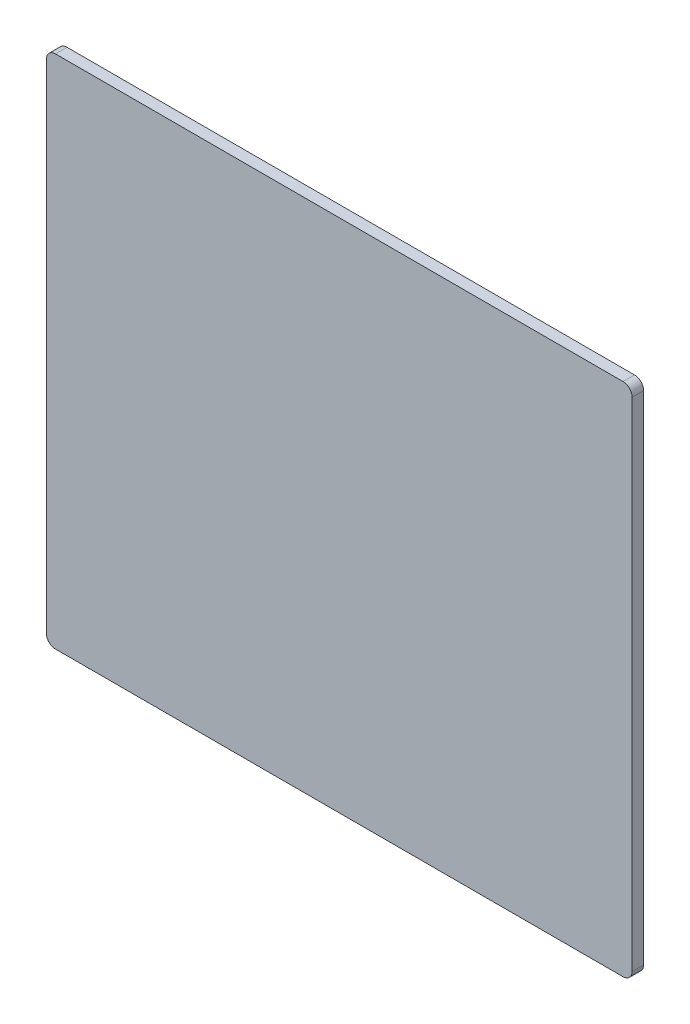
ISO-10303-21;
HEADER;
FILE_DESCRIPTION(('STEP AP214'),'2;1');
FILE_NAME('part.step','',(''),(''),'','','');
FILE_SCHEMA(('AUTOMOTIVE_DESIGN { 1 0 10303 214 1 1 1 1 }'));
ENDSEC;
DATA;
#1=APPLICATION_CONTEXT('core data for automotive mechanical design processes');
#2=APPLICATION_PROTOCOL_DEFINITION('international standard','automotive_design',2000,#1);
#3=PRODUCT_CONTEXT('',#1,'mechanical');
#4=PRODUCT('Part','Part','',(#3));
#5=PRODUCT_RELATED_PRODUCT_CATEGORY('part','',(#4));
#6=PRODUCT_DEFINITION_FORMATION('','',#4);
#7=PRODUCT_DEFINITION_CONTEXT('part definition',#1,'design');
#8=PRODUCT_DEFINITION('design','',#6,#7);
#9=PRODUCT_DEFINITION_SHAPE('','',#8);
#10=(LENGTH_UNIT() NAMED_UNIT(*) SI_UNIT(.MILLI.,.METRE.));
#11=(NAMED_UNIT(*) PLANE_ANGLE_UNIT() SI_UNIT($,.RADIAN.));
#12=(NAMED_UNIT(*) SI_UNIT($,.STERADIAN.) SOLID_ANGLE_UNIT());
#13=UNCERTAINTY_MEASURE_WITH_UNIT(LENGTH_MEASURE(1.E-05),#10,'distance_accuracy_value','');
#14=(GEOMETRIC_REPRESENTATION_CONTEXT(3) GLOBAL_UNCERTAINTY_ASSIGNED_CONTEXT((#13)) GLOBAL_UNIT_ASSIGNED_CONTEXT((#10,
#11,#12)) REPRESENTATION_CONTEXT('',''));
#15=CARTESIAN_POINT('',(0.,0.,0.));
#16=DIRECTION('',(0.,0.,1.));
#17=DIRECTION('',(1.,0.,0.));
#18=AXIS2_PLACEMENT_3D('',#15,#16,#17);
#19=CARTESIAN_POINT('',(-476.498046875,137.467578125,12.7));
#20=DIRECTION('',(1.,0.,0.));
#21=DIRECTION('',(0.,1.,0.));
#22=AXIS2_PLACEMENT_3D('',#19,#20,#21);
#23=PLANE('',#22);
#24=DIRECTION('',(0.,-1.,0.));
#25=VECTOR('',#24,1.);
#26=CARTESIAN_POINT('',(-476.498046875,137.467578125,0.));
#27=LINE('',#26,#25);
#28=CARTESIAN_POINT('',(-476.498046875,127.467578125,0.));
#29=VERTEX_POINT('',#28);
#30=CARTESIAN_POINT('',(-476.498046875,-422.508421875,0.));
#31=VERTEX_POINT('',#30);
#32=EDGE_CURVE('E188',#29,#31,#27,.T.);
#33=ORIENTED_EDGE('',*,*,#32,.T.);
#34=DIRECTION('',(0.,0.,-1.));
#35=VECTOR('',#34,1.);
#36=CARTESIAN_POINT('',(-476.498046875,-422.508421875,12.7));
#37=LINE('',#36,#35);
#38=CARTESIAN_POINT('',(-476.498046875,-422.508421875,12.7));
#39=VERTEX_POINT('',#38);
#40=EDGE_CURVE('E173',#31,#39,#37,.F.);
#41=ORIENTED_EDGE('',*,*,#40,.T.);
#42=DIRECTION('',(0.,-1.,0.));
#43=VECTOR('',#42,1.);
#44=CARTESIAN_POINT('',(-476.498046875,137.467578125,12.7));
#45=LINE('',#44,#43);
#46=CARTESIAN_POINT('',(-476.498046875,127.467578125,12.7));
#47=VERTEX_POINT('',#46);
#48=EDGE_CURVE('E190',#47,#39,#45,.T.);
#49=ORIENTED_EDGE('',*,*,#48,.F.);
#50=DIRECTION('',(0.,0.,-1.));
#51=VECTOR('',#50,1.);
#52=CARTESIAN_POINT('',(-476.498046875,127.467578125,0.));
#53=LINE('',#52,#51);
#54=EDGE_CURVE('E169',#47,#29,#53,.T.);
#55=ORIENTED_EDGE('',*,*,#54,.T.);
#56=EDGE_LOOP('',(#33,#41,#49,#55));
#57=FACE_BOUND('',#56,.T.);
#58=ADVANCED_FACE('F45',(#57),#23,.F.);
#59=CARTESIAN_POINT('',(-476.498046875,-432.508421875,12.7));
#60=DIRECTION('',(0.,1.,0.));
#61=DIRECTION('',(0.,0.,1.));
#62=AXIS2_PLACEMENT_3D('',#59,#60,#61);
#63=PLANE('',#62);
#64=DIRECTION('',(1.,0.,0.));
#65=VECTOR('',#64,1.);
#66=CARTESIAN_POINT('',(-476.498046875,-432.508421875,0.));
#67=LINE('',#66,#65);
#68=CARTESIAN_POINT('',(-466.498046875,-432.508421875,0.));
#69=VERTEX_POINT('',#68);
#70=CARTESIAN_POINT('',(161.201953125,-432.508421875,0.));
#71=VERTEX_POINT('',#70);
#72=EDGE_CURVE('E131',#69,#71,#67,.T.);
#73=ORIENTED_EDGE('',*,*,#72,.T.);
#74=DIRECTION('',(0.,0.,-1.));
#75=VECTOR('',#74,1.);
#76=CARTESIAN_POINT('',(161.201953125,-432.508421875,12.7));
#77=LINE('',#76,#75);
#78=CARTESIAN_POINT('',(161.201953125,-432.508421875,12.7));
#79=VERTEX_POINT('',#78);
#80=EDGE_CURVE('E155',#71,#79,#77,.F.);
#81=ORIENTED_EDGE('',*,*,#80,.T.);
#82=DIRECTION('',(1.,0.,0.));
#83=VECTOR('',#82,1.);
#84=CARTESIAN_POINT('',(-476.498046875,-432.508421875,12.7));
#85=LINE('',#84,#83);
#86=CARTESIAN_POINT('',(-466.498046875,-432.508421875,12.7));
#87=VERTEX_POINT('',#86);
#88=EDGE_CURVE('E200',#87,#79,#85,.T.);
#89=ORIENTED_EDGE('',*,*,#88,.F.);
#90=DIRECTION('',(0.,0.,-1.));
#91=VECTOR('',#90,1.);
#92=CARTESIAN_POINT('',(-466.498046875,-432.508421875,12.7));
#93=LINE('',#92,#91);
#94=EDGE_CURVE('E151',#87,#69,#93,.T.);
#95=ORIENTED_EDGE('',*,*,#94,.T.);
#96=EDGE_LOOP('',(#73,#81,#89,#95));
#97=FACE_BOUND('',#96,.T.);
#98=ADVANCED_FACE('F211',(#97),#63,.F.);
#99=CARTESIAN_POINT('',(171.201953125,137.467578125,12.7));
#100=DIRECTION('',(1.,0.,0.));
#101=DIRECTION('',(0.,1.,0.));
#102=AXIS2_PLACEMENT_3D('',#99,#100,#101);
#103=PLANE('',#102);
#104=DIRECTION('',(0.,-1.,0.));
#105=VECTOR('',#104,1.);
#106=CARTESIAN_POINT('',(171.201953125,137.467578125,12.7));
#107=LINE('',#106,#105);
#108=CARTESIAN_POINT('',(171.201953125,127.467578125,12.7));
#109=VERTEX_POINT('',#108);
#110=CARTESIAN_POINT('',(171.201953125,-422.508421875,12.7));
#111=VERTEX_POINT('',#110);
#112=EDGE_CURVE('E139',#109,#111,#107,.T.);
#113=ORIENTED_EDGE('',*,*,#112,.T.);
#114=DIRECTION('',(0.,0.,-1.));
#115=VECTOR('',#114,1.);
#116=CARTESIAN_POINT('',(171.201953125,-422.508421875,0.));
#117=LINE('',#116,#115);
#118=CARTESIAN_POINT('',(171.201953125,-422.508421875,0.));
#119=VERTEX_POINT('',#118);
#120=EDGE_CURVE('E122',#111,#119,#117,.T.);
#121=ORIENTED_EDGE('',*,*,#120,.T.);
#122=DIRECTION('',(0.,-1.,0.));
#123=VECTOR('',#122,1.);
#124=CARTESIAN_POINT('',(171.201953125,137.467578125,0.));
#125=LINE('',#124,#123);
#126=CARTESIAN_POINT('',(171.201953125,127.467578125,0.));
#127=VERTEX_POINT('',#126);
#128=EDGE_CURVE('E114',#127,#119,#125,.T.);
#129=ORIENTED_EDGE('',*,*,#128,.F.);
#130=DIRECTION('',(0.,0.,-1.));
#131=VECTOR('',#130,1.);
#132=CARTESIAN_POINT('',(171.201953125,127.467578125,12.7));
#133=LINE('',#132,#131);
#134=EDGE_CURVE('E128',#127,#109,#133,.F.);
#135=ORIENTED_EDGE('',*,*,#134,.T.);
#136=EDGE_LOOP('',(#113,#121,#129,#135));
#137=FACE_BOUND('',#136,.T.);
#138=ADVANCED_FACE('F127',(#137),#103,.T.);
#139=CARTESIAN_POINT('',(-476.498046875,137.467578125,12.7));
#140=DIRECTION('',(0.,1.,0.));
#141=DIRECTION('',(0.,0.,1.));
#142=AXIS2_PLACEMENT_3D('',#139,#140,#141);
#143=PLANE('',#142);
#144=DIRECTION('',(1.,0.,0.));
#145=VECTOR('',#144,1.);
#146=CARTESIAN_POINT('',(-476.498046875,137.467578125,0.));
#147=LINE('',#146,#145);
#148=CARTESIAN_POINT('',(-466.498046875,137.467578125,0.));
#149=VERTEX_POINT('',#148);
#150=CARTESIAN_POINT('',(161.201953125,137.467578125,0.));
#151=VERTEX_POINT('',#150);
#152=EDGE_CURVE('E115',#149,#151,#147,.T.);
#153=ORIENTED_EDGE('',*,*,#152,.F.);
#154=DIRECTION('',(0.,0.,-1.));
#155=VECTOR('',#154,1.);
#156=CARTESIAN_POINT('',(-466.498046875,137.467578125,12.7));
#157=LINE('',#156,#155);
#158=CARTESIAN_POINT('',(-466.498046875,137.467578125,12.7));
#159=VERTEX_POINT('',#158);
#160=EDGE_CURVE('E11',#149,#159,#157,.F.);
#161=ORIENTED_EDGE('',*,*,#160,.T.);
#162=DIRECTION('',(1.,0.,0.));
#163=VECTOR('',#162,1.);
#164=CARTESIAN_POINT('',(-476.498046875,137.467578125,12.7));
#165=LINE('',#164,#163);
#166=CARTESIAN_POINT('',(161.201953125,137.467578125,12.7));
#167=VERTEX_POINT('',#166);
#168=EDGE_CURVE('E134',#159,#167,#165,.T.);
#169=ORIENTED_EDGE('',*,*,#168,.T.);
#170=DIRECTION('',(0.,0.,-1.));
#171=VECTOR('',#170,1.);
#172=CARTESIAN_POINT('',(161.201953125,137.467578125,12.7));
#173=LINE('',#172,#171);
#174=EDGE_CURVE('E54',#167,#151,#173,.T.);
#175=ORIENTED_EDGE('',*,*,#174,.T.);
#176=EDGE_LOOP('',(#153,#161,#169,#175));
#177=FACE_BOUND('',#176,.T.);
#178=ADVANCED_FACE('F176',(#177),#143,.T.);
#179=CARTESIAN_POINT('',(0.,0.,12.7));
#180=DIRECTION('',(0.,0.,1.));
#181=DIRECTION('',(1.,0.,0.));
#182=AXIS2_PLACEMENT_3D('',#179,#180,#181);
#183=PLANE('',#182);
#184=ORIENTED_EDGE('',*,*,#88,.T.);
#185=CARTESIAN_POINT('',(161.201953125,-422.508421875,12.7));
#186=DIRECTION('',(0.,0.,1.));
#187=DIRECTION('',(1.,0.,0.));
#188=AXIS2_PLACEMENT_3D('',#185,#186,#187);
#189=CIRCLE('',#188,10.);
#190=EDGE_CURVE('E166',#79,#111,#189,.T.);
#191=ORIENTED_EDGE('',*,*,#190,.T.);
#192=ORIENTED_EDGE('',*,*,#112,.F.);
#193=CARTESIAN_POINT('',(161.201953125,127.467578125,12.7));
#194=DIRECTION('',(0.,0.,1.));
#195=DIRECTION('',(1.,0.,0.));
#196=AXIS2_PLACEMENT_3D('',#193,#194,#195);
#197=CIRCLE('',#196,10.);
#198=EDGE_CURVE('E61',#109,#167,#197,.T.);
#199=ORIENTED_EDGE('',*,*,#198,.T.);
#200=ORIENTED_EDGE('',*,*,#168,.F.);
#201=CARTESIAN_POINT('',(-466.498046875,127.467578125,12.7));
#202=DIRECTION('',(0.,0.,1.));
#203=DIRECTION('',(1.,0.,0.));
#204=AXIS2_PLACEMENT_3D('',#201,#202,#203);
#205=CIRCLE('',#204,10.);
#206=EDGE_CURVE('E160',#159,#47,#205,.T.);
#207=ORIENTED_EDGE('',*,*,#206,.T.);
#208=ORIENTED_EDGE('',*,*,#48,.T.);
#209=CARTESIAN_POINT('',(-466.498046875,-422.508421875,12.7));
#210=DIRECTION('',(0.,0.,1.));
#211=DIRECTION('',(1.,0.,0.));
#212=AXIS2_PLACEMENT_3D('',#209,#210,#211);
#213=CIRCLE('',#212,10.);
#214=EDGE_CURVE('E163',#39,#87,#213,.T.);
#215=ORIENTED_EDGE('',*,*,#214,.T.);
#216=EDGE_LOOP('',(#184,#191,#192,#199,#200,#207,#208,#215));
#217=FACE_BOUND('',#216,.T.);
#218=ADVANCED_FACE('F179',(#217),#183,.T.);
#219=CARTESIAN_POINT('',(0.,0.,0.));
#220=DIRECTION('',(0.,0.,1.));
#221=DIRECTION('',(1.,0.,0.));
#222=AXIS2_PLACEMENT_3D('',#219,#220,#221);
#223=PLANE('',#222);
#224=ORIENTED_EDGE('',*,*,#128,.T.);
#225=CARTESIAN_POINT('',(161.201953125,-422.508421875,0.));
#226=DIRECTION('',(0.,0.,1.));
#227=DIRECTION('',(1.,0.,0.));
#228=AXIS2_PLACEMENT_3D('',#225,#226,#227);
#229=CIRCLE('',#228,10.);
#230=EDGE_CURVE('E148',#119,#71,#229,.F.);
#231=ORIENTED_EDGE('',*,*,#230,.T.);
#232=ORIENTED_EDGE('',*,*,#72,.F.);
#233=CARTESIAN_POINT('',(-466.498046875,-422.508421875,0.));
#234=DIRECTION('',(0.,0.,1.));
#235=DIRECTION('',(1.,0.,0.));
#236=AXIS2_PLACEMENT_3D('',#233,#234,#235);
#237=CIRCLE('',#236,10.);
#238=EDGE_CURVE('E145',#69,#31,#237,.F.);
#239=ORIENTED_EDGE('',*,*,#238,.T.);
#240=ORIENTED_EDGE('',*,*,#32,.F.);
#241=CARTESIAN_POINT('',(-466.498046875,127.467578125,0.));
#242=DIRECTION('',(0.,0.,1.));
#243=DIRECTION('',(1.,0.,0.));
#244=AXIS2_PLACEMENT_3D('',#241,#242,#243);
#245=CIRCLE('',#244,10.);
#246=EDGE_CURVE('E121',#29,#149,#245,.F.);
#247=ORIENTED_EDGE('',*,*,#246,.T.);
#248=ORIENTED_EDGE('',*,*,#152,.T.);
#249=CARTESIAN_POINT('',(161.201953125,127.467578125,0.));
#250=DIRECTION('',(0.,0.,1.));
#251=DIRECTION('',(1.,0.,0.));
#252=AXIS2_PLACEMENT_3D('',#249,#250,#251);
#253=CIRCLE('',#252,10.);
#254=EDGE_CURVE('E111',#151,#127,#253,.F.);
#255=ORIENTED_EDGE('',*,*,#254,.T.);
#256=EDGE_LOOP('',(#224,#231,#232,#239,#240,#247,#248,#255));
#257=FACE_BOUND('',#256,.T.);
#258=ADVANCED_FACE('F113',(#257),#223,.F.);
#259=CARTESIAN_POINT('',(161.201953125,-422.508421875,12.7));
#260=DIRECTION('',(0.,0.,1.));
#261=DIRECTION('',(1.,0.,0.));
#262=AXIS2_PLACEMENT_3D('',#259,#260,#261);
#263=CYLINDRICAL_SURFACE('',#262,10.);
#264=ORIENTED_EDGE('',*,*,#190,.F.);
#265=ORIENTED_EDGE('',*,*,#80,.F.);
#266=ORIENTED_EDGE('',*,*,#230,.F.);
#267=ORIENTED_EDGE('',*,*,#120,.F.);
#268=EDGE_LOOP('',(#264,#265,#266,#267));
#269=FACE_BOUND('',#268,.T.);
#270=ADVANCED_FACE('F215',(#269),#263,.T.);
#271=CARTESIAN_POINT('',(-466.498046875,-422.508421875,12.7));
#272=DIRECTION('',(0.,0.,-1.));
#273=DIRECTION('',(-1.,0.,0.));
#274=AXIS2_PLACEMENT_3D('',#271,#272,#273);
#275=CYLINDRICAL_SURFACE('',#274,10.);
#276=ORIENTED_EDGE('',*,*,#214,.F.);
#277=ORIENTED_EDGE('',*,*,#40,.F.);
#278=ORIENTED_EDGE('',*,*,#238,.F.);
#279=ORIENTED_EDGE('',*,*,#94,.F.);
#280=EDGE_LOOP('',(#276,#277,#278,#279));
#281=FACE_BOUND('',#280,.T.);
#282=ADVANCED_FACE('F209',(#281),#275,.T.);
#283=CARTESIAN_POINT('',(-466.498046875,127.467578125,12.7));
#284=DIRECTION('',(0.,0.,1.));
#285=DIRECTION('',(1.,0.,0.));
#286=AXIS2_PLACEMENT_3D('',#283,#284,#285);
#287=CYLINDRICAL_SURFACE('',#286,10.);
#288=ORIENTED_EDGE('',*,*,#206,.F.);
#289=ORIENTED_EDGE('',*,*,#160,.F.);
#290=ORIENTED_EDGE('',*,*,#246,.F.);
#291=ORIENTED_EDGE('',*,*,#54,.F.);
#292=EDGE_LOOP('',(#288,#289,#290,#291));
#293=FACE_BOUND('',#292,.T.);
#294=ADVANCED_FACE('F184',(#293),#287,.T.);
#295=CARTESIAN_POINT('',(161.201953125,127.467578125,12.7));
#296=DIRECTION('',(0.,0.,-1.));
#297=DIRECTION('',(-1.,0.,0.));
#298=AXIS2_PLACEMENT_3D('',#295,#296,#297);
#299=CYLINDRICAL_SURFACE('',#298,10.);
#300=ORIENTED_EDGE('',*,*,#198,.F.);
#301=ORIENTED_EDGE('',*,*,#134,.F.);
#302=ORIENTED_EDGE('',*,*,#254,.F.);
#303=ORIENTED_EDGE('',*,*,#174,.F.);
#304=EDGE_LOOP('',(#300,#301,#302,#303));
#305=FACE_BOUND('',#304,.T.);
#306=ADVANCED_FACE('F47',(#305),#299,.T.);
#307=CLOSED_SHELL('',(#58,#98,#138,#178,#218,#258,#270,#282,#294,#306));
#308=MANIFOLD_SOLID_BREP('B2',#307);
#309=ADVANCED_BREP_SHAPE_REPRESENTATION('',(#18,#308),#14);
#310=SHAPE_DEFINITION_REPRESENTATION(#9,#309);
ENDSEC;
END-ISO-10303-21;
